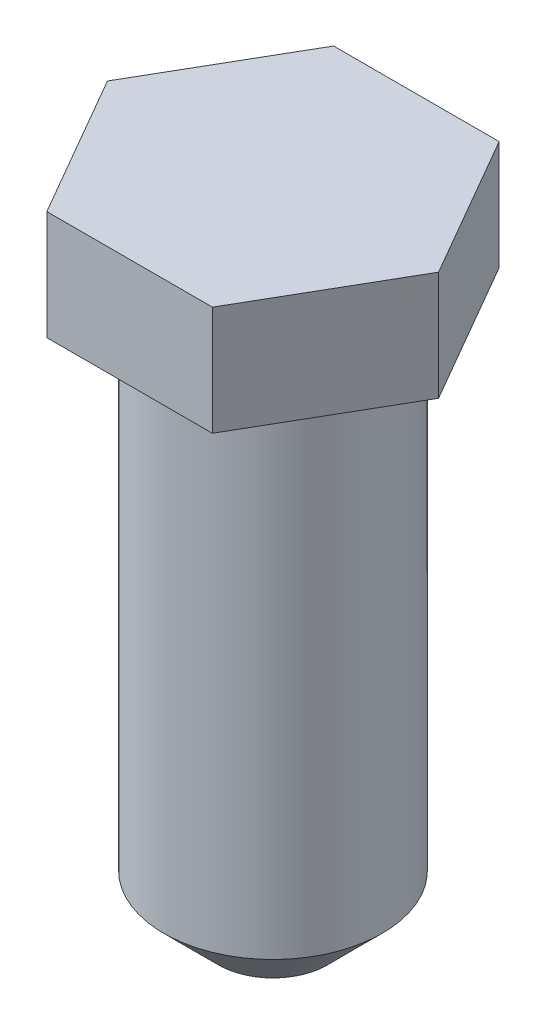
ISO-10303-21;
HEADER;
FILE_DESCRIPTION(('STEP AP214'),'2;1');
FILE_NAME('part.step','',(''),(''),'','','');
FILE_SCHEMA(('AUTOMOTIVE_DESIGN { 1 0 10303 214 1 1 1 1 }'));
ENDSEC;
DATA;
#1=APPLICATION_CONTEXT('core data for automotive mechanical design processes');
#2=APPLICATION_PROTOCOL_DEFINITION('international standard','automotive_design',2000,#1);
#3=PRODUCT_CONTEXT('',#1,'mechanical');
#4=PRODUCT('Part','Part','',(#3));
#5=PRODUCT_RELATED_PRODUCT_CATEGORY('part','',(#4));
#6=PRODUCT_DEFINITION_FORMATION('','',#4);
#7=PRODUCT_DEFINITION_CONTEXT('part definition',#1,'design');
#8=PRODUCT_DEFINITION('design','',#6,#7);
#9=PRODUCT_DEFINITION_SHAPE('','',#8);
#10=(LENGTH_UNIT() NAMED_UNIT(*) SI_UNIT(.MILLI.,.METRE.));
#11=(NAMED_UNIT(*) PLANE_ANGLE_UNIT() SI_UNIT($,.RADIAN.));
#12=(NAMED_UNIT(*) SI_UNIT($,.STERADIAN.) SOLID_ANGLE_UNIT());
#13=UNCERTAINTY_MEASURE_WITH_UNIT(LENGTH_MEASURE(1.E-05),#10,'distance_accuracy_value','');
#14=(GEOMETRIC_REPRESENTATION_CONTEXT(3) GLOBAL_UNCERTAINTY_ASSIGNED_CONTEXT((#13)) GLOBAL_UNIT_ASSIGNED_CONTEXT((#10,
#11,#12)) REPRESENTATION_CONTEXT('',''));
#15=CARTESIAN_POINT('',(0.,0.,0.));
#16=DIRECTION('',(0.,0.,1.));
#17=DIRECTION('',(1.,0.,0.));
#18=AXIS2_PLACEMENT_3D('',#15,#16,#17);
#19=CARTESIAN_POINT('',(9.62370729955479,12.7,16.6687499999999));
#20=DIRECTION('',(-0.866025403784442,0.,-0.499999999999995));
#21=DIRECTION('',(-0.499999999999995,0.,0.866025403784442));
#22=AXIS2_PLACEMENT_3D('',#19,#20,#21);
#23=PLANE('',#22);
#24=DIRECTION('',(0.499999999999995,0.,-0.866025403784442));
#25=VECTOR('',#24,1.);
#26=CARTESIAN_POINT('',(9.62370729955479,0.,16.6687499999999));
#27=LINE('',#26,#25);
#28=CARTESIAN_POINT('',(9.62370729955479,0.,16.6687499999999));
#29=VERTEX_POINT('',#28);
#30=CARTESIAN_POINT('',(19.2474145991092,0.,0.));
#31=VERTEX_POINT('',#30);
#32=EDGE_CURVE('E119',#29,#31,#27,.T.);
#33=ORIENTED_EDGE('',*,*,#32,.T.);
#34=DIRECTION('',(0.,-1.,0.));
#35=VECTOR('',#34,1.);
#36=CARTESIAN_POINT('',(19.2474145991092,12.7,0.));
#37=LINE('',#36,#35);
#38=CARTESIAN_POINT('',(19.2474145991092,12.7,0.));
#39=VERTEX_POINT('',#38);
#40=EDGE_CURVE('E136',#39,#31,#37,.T.);
#41=ORIENTED_EDGE('',*,*,#40,.F.);
#42=DIRECTION('',(0.499999999999995,0.,-0.866025403784442));
#43=VECTOR('',#42,1.);
#44=CARTESIAN_POINT('',(9.62370729955479,12.7,16.6687499999999));
#45=LINE('',#44,#43);
#46=CARTESIAN_POINT('',(9.62370729955479,12.7,16.6687499999999));
#47=VERTEX_POINT('',#46);
#48=EDGE_CURVE('E129',#47,#39,#45,.T.);
#49=ORIENTED_EDGE('',*,*,#48,.F.);
#50=DIRECTION('',(0.,-1.,0.));
#51=VECTOR('',#50,1.);
#52=CARTESIAN_POINT('',(9.62370729955479,12.7,16.6687499999999));
#53=LINE('',#52,#51);
#54=EDGE_CURVE('E115',#47,#29,#53,.T.);
#55=ORIENTED_EDGE('',*,*,#54,.T.);
#56=EDGE_LOOP('',(#33,#41,#49,#55));
#57=FACE_BOUND('',#56,.T.);
#58=ADVANCED_FACE('F33',(#57),#23,.F.);
#59=CARTESIAN_POINT('',(19.2474145991092,12.7,0.));
#60=DIRECTION('',(-0.866025403784438,0.,0.500000000000001));
#61=DIRECTION('',(0.500000000000001,0.,0.866025403784438));
#62=AXIS2_PLACEMENT_3D('',#59,#60,#61);
#63=PLANE('',#62);
#64=DIRECTION('',(-0.500000000000001,0.,-0.866025403784438));
#65=VECTOR('',#64,1.);
#66=CARTESIAN_POINT('',(19.2474145991092,0.,0.));
#67=LINE('',#66,#65);
#68=CARTESIAN_POINT('',(9.62370729955456,0.,-16.6687500000001));
#69=VERTEX_POINT('',#68);
#70=EDGE_CURVE('E122',#31,#69,#67,.T.);
#71=ORIENTED_EDGE('',*,*,#70,.T.);
#72=DIRECTION('',(0.,-1.,0.));
#73=VECTOR('',#72,1.);
#74=CARTESIAN_POINT('',(9.62370729955456,12.7,-16.6687500000001));
#75=LINE('',#74,#73);
#76=CARTESIAN_POINT('',(9.62370729955456,12.7,-16.6687500000001));
#77=VERTEX_POINT('',#76);
#78=EDGE_CURVE('E133',#77,#69,#75,.T.);
#79=ORIENTED_EDGE('',*,*,#78,.F.);
#80=DIRECTION('',(-0.500000000000001,0.,-0.866025403784438));
#81=VECTOR('',#80,1.);
#82=CARTESIAN_POINT('',(19.2474145991092,12.7,0.));
#83=LINE('',#82,#81);
#84=EDGE_CURVE('E88',#39,#77,#83,.T.);
#85=ORIENTED_EDGE('',*,*,#84,.F.);
#86=ORIENTED_EDGE('',*,*,#40,.T.);
#87=EDGE_LOOP('',(#71,#79,#85,#86));
#88=FACE_BOUND('',#87,.T.);
#89=ADVANCED_FACE('F149',(#88),#63,.F.);
#90=CARTESIAN_POINT('',(9.62370729955456,12.7,-16.6687500000001));
#91=DIRECTION('',(0.,0.,1.));
#92=DIRECTION('',(1.,0.,0.));
#93=AXIS2_PLACEMENT_3D('',#90,#91,#92);
#94=PLANE('',#93);
#95=DIRECTION('',(-1.,0.,0.));
#96=VECTOR('',#95,1.);
#97=CARTESIAN_POINT('',(9.62370729955456,0.,-16.6687500000001));
#98=LINE('',#97,#96);
#99=CARTESIAN_POINT('',(-9.62370729955468,0.,-16.66875));
#100=VERTEX_POINT('',#99);
#101=EDGE_CURVE('E124',#69,#100,#98,.T.);
#102=ORIENTED_EDGE('',*,*,#101,.T.);
#103=DIRECTION('',(0.,-1.,0.));
#104=VECTOR('',#103,1.);
#105=CARTESIAN_POINT('',(-9.62370729955468,12.7,-16.66875));
#106=LINE('',#105,#104);
#107=CARTESIAN_POINT('',(-9.62370729955468,12.7,-16.66875));
#108=VERTEX_POINT('',#107);
#109=EDGE_CURVE('E110',#108,#100,#106,.T.);
#110=ORIENTED_EDGE('',*,*,#109,.F.);
#111=DIRECTION('',(-1.,0.,0.));
#112=VECTOR('',#111,1.);
#113=CARTESIAN_POINT('',(9.62370729955456,12.7,-16.6687500000001));
#114=LINE('',#113,#112);
#115=EDGE_CURVE('E101',#77,#108,#114,.T.);
#116=ORIENTED_EDGE('',*,*,#115,.F.);
#117=ORIENTED_EDGE('',*,*,#78,.T.);
#118=EDGE_LOOP('',(#102,#110,#116,#117));
#119=FACE_BOUND('',#118,.T.);
#120=ADVANCED_FACE('F152',(#119),#94,.F.);
#121=CARTESIAN_POINT('',(-9.62370729955468,12.7,-16.66875));
#122=DIRECTION('',(0.866025403784442,0.,0.499999999999995));
#123=DIRECTION('',(0.499999999999995,0.,-0.866025403784442));
#124=AXIS2_PLACEMENT_3D('',#121,#122,#123);
#125=PLANE('',#124);
#126=DIRECTION('',(-0.499999999999995,0.,0.866025403784442));
#127=VECTOR('',#126,1.);
#128=CARTESIAN_POINT('',(-9.62370729955468,0.,-16.66875));
#129=LINE('',#128,#127);
#130=CARTESIAN_POINT('',(-19.2474145991092,0.,1.34403977787533E-13));
#131=VERTEX_POINT('',#130);
#132=EDGE_CURVE('E109',#100,#131,#129,.T.);
#133=ORIENTED_EDGE('',*,*,#132,.T.);
#134=DIRECTION('',(0.,-1.,0.));
#135=VECTOR('',#134,1.);
#136=CARTESIAN_POINT('',(-19.2474145991092,12.7,1.34403977787533E-13));
#137=LINE('',#136,#135);
#138=CARTESIAN_POINT('',(-19.2474145991092,12.7,1.34403977787533E-13));
#139=VERTEX_POINT('',#138);
#140=EDGE_CURVE('E106',#139,#131,#137,.T.);
#141=ORIENTED_EDGE('',*,*,#140,.F.);
#142=DIRECTION('',(-0.499999999999995,0.,0.866025403784442));
#143=VECTOR('',#142,1.);
#144=CARTESIAN_POINT('',(-9.62370729955468,12.7,-16.66875));
#145=LINE('',#144,#143);
#146=EDGE_CURVE('E95',#108,#139,#145,.T.);
#147=ORIENTED_EDGE('',*,*,#146,.F.);
#148=ORIENTED_EDGE('',*,*,#109,.T.);
#149=EDGE_LOOP('',(#133,#141,#147,#148));
#150=FACE_BOUND('',#149,.T.);
#151=ADVANCED_FACE('F107',(#150),#125,.F.);
#152=CARTESIAN_POINT('',(-19.2474145991092,12.7,1.34403977787533E-13));
#153=DIRECTION('',(0.866025403784434,0.,-0.500000000000007));
#154=DIRECTION('',(-0.500000000000007,0.,-0.866025403784435));
#155=AXIS2_PLACEMENT_3D('',#152,#153,#154);
#156=PLANE('',#155);
#157=DIRECTION('',(0.500000000000007,0.,0.866025403784435));
#158=VECTOR('',#157,1.);
#159=CARTESIAN_POINT('',(-19.2474145991092,0.,1.34403977787533E-13));
#160=LINE('',#159,#158);
#161=CARTESIAN_POINT('',(-9.62370729955445,0.,16.6687500000001));
#162=VERTEX_POINT('',#161);
#163=EDGE_CURVE('E73',#131,#162,#160,.T.);
#164=ORIENTED_EDGE('',*,*,#163,.T.);
#165=DIRECTION('',(0.,-1.,0.));
#166=VECTOR('',#165,1.);
#167=CARTESIAN_POINT('',(-9.62370729955445,12.7,16.6687500000001));
#168=LINE('',#167,#166);
#169=CARTESIAN_POINT('',(-9.62370729955445,12.7,16.6687500000001));
#170=VERTEX_POINT('',#169);
#171=EDGE_CURVE('E111',#170,#162,#168,.T.);
#172=ORIENTED_EDGE('',*,*,#171,.F.);
#173=DIRECTION('',(0.500000000000007,0.,0.866025403784435));
#174=VECTOR('',#173,1.);
#175=CARTESIAN_POINT('',(-19.2474145991092,12.7,1.34403977787533E-13));
#176=LINE('',#175,#174);
#177=EDGE_CURVE('E99',#139,#170,#176,.T.);
#178=ORIENTED_EDGE('',*,*,#177,.F.);
#179=ORIENTED_EDGE('',*,*,#140,.T.);
#180=EDGE_LOOP('',(#164,#172,#178,#179));
#181=FACE_BOUND('',#180,.T.);
#182=ADVANCED_FACE('F113',(#181),#156,.F.);
#183=CARTESIAN_POINT('',(-9.62370729955445,12.7,16.6687500000001));
#184=DIRECTION('',(0.,0.,-1.));
#185=DIRECTION('',(-1.,0.,0.));
#186=AXIS2_PLACEMENT_3D('',#183,#184,#185);
#187=PLANE('',#186);
#188=DIRECTION('',(1.,0.,0.));
#189=VECTOR('',#188,1.);
#190=CARTESIAN_POINT('',(-9.62370729955445,0.,16.6687500000001));
#191=LINE('',#190,#189);
#192=EDGE_CURVE('E79',#162,#29,#191,.T.);
#193=ORIENTED_EDGE('',*,*,#192,.T.);
#194=ORIENTED_EDGE('',*,*,#54,.F.);
#195=DIRECTION('',(1.,0.,0.));
#196=VECTOR('',#195,1.);
#197=CARTESIAN_POINT('',(-9.62370729955445,12.7,16.6687500000001));
#198=LINE('',#197,#196);
#199=EDGE_CURVE('E50',#170,#47,#198,.T.);
#200=ORIENTED_EDGE('',*,*,#199,.F.);
#201=ORIENTED_EDGE('',*,*,#171,.T.);
#202=EDGE_LOOP('',(#193,#194,#200,#201));
#203=FACE_BOUND('',#202,.T.);
#204=ADVANCED_FACE('F157',(#203),#187,.F.);
#205=CARTESIAN_POINT('',(0.,12.7,0.));
#206=DIRECTION('',(0.,1.,0.));
#207=DIRECTION('',(0.,0.,1.));
#208=AXIS2_PLACEMENT_3D('',#205,#206,#207);
#209=PLANE('',#208);
#210=ORIENTED_EDGE('',*,*,#48,.T.);
#211=ORIENTED_EDGE('',*,*,#84,.T.);
#212=ORIENTED_EDGE('',*,*,#115,.T.);
#213=ORIENTED_EDGE('',*,*,#146,.T.);
#214=ORIENTED_EDGE('',*,*,#177,.T.);
#215=ORIENTED_EDGE('',*,*,#199,.T.);
#216=EDGE_LOOP('',(#210,#211,#212,#213,#214,#215));
#217=FACE_BOUND('',#216,.T.);
#218=ADVANCED_FACE('F97',(#217),#209,.T.);
#219=CARTESIAN_POINT('',(0.,0.,0.));
#220=DIRECTION('',(0.,1.,0.));
#221=DIRECTION('',(0.,0.,1.));
#222=AXIS2_PLACEMENT_3D('',#219,#220,#221);
#223=PLANE('',#222);
#224=CARTESIAN_POINT('',(0.,0.,0.));
#225=DIRECTION('',(0.,-1.,0.));
#226=DIRECTION('',(0.,0.,-1.));
#227=AXIS2_PLACEMENT_3D('',#224,#225,#226);
#228=CIRCLE('',#227,12.7);
#229=CARTESIAN_POINT('',(0.,0.,-12.7));
#230=VERTEX_POINT('',#229);
#231=EDGE_CURVE('E137',#230,#230,#228,.T.);
#232=ORIENTED_EDGE('',*,*,#231,.F.);
#233=EDGE_LOOP('',(#232));
#234=FACE_BOUND('',#233,.T.);
#235=ORIENTED_EDGE('',*,*,#32,.F.);
#236=ORIENTED_EDGE('',*,*,#192,.F.);
#237=ORIENTED_EDGE('',*,*,#163,.F.);
#238=ORIENTED_EDGE('',*,*,#132,.F.);
#239=ORIENTED_EDGE('',*,*,#101,.F.);
#240=ORIENTED_EDGE('',*,*,#70,.F.);
#241=EDGE_LOOP('',(#235,#236,#237,#238,#239,#240));
#242=FACE_BOUND('',#241,.T.);
#243=ADVANCED_FACE('F155',(#234,#242),#223,.F.);
#244=CARTESIAN_POINT('',(0.,-57.15,0.));
#245=DIRECTION('',(0.,1.,0.));
#246=DIRECTION('',(0.,0.,1.));
#247=AXIS2_PLACEMENT_3D('',#244,#245,#246);
#248=CYLINDRICAL_SURFACE('',#247,12.7);
#249=CARTESIAN_POINT('',(0.,-57.15,0.));
#250=DIRECTION('',(0.,-1.,0.));
#251=DIRECTION('',(0.,0.,-1.));
#252=AXIS2_PLACEMENT_3D('',#249,#250,#251);
#253=CIRCLE('',#252,12.7);
#254=CARTESIAN_POINT('',(0.,-57.15,-12.7));
#255=VERTEX_POINT('',#254);
#256=EDGE_CURVE('E11',#255,#255,#253,.F.);
#257=ORIENTED_EDGE('',*,*,#256,.T.);
#258=EDGE_LOOP('',(#257));
#259=FACE_BOUND('',#258,.T.);
#260=ORIENTED_EDGE('',*,*,#231,.T.);
#261=EDGE_LOOP('',(#260));
#262=FACE_BOUND('',#261,.T.);
#263=ADVANCED_FACE('F203',(#259,#262),#248,.T.);
#264=CARTESIAN_POINT('',(0.,-63.5,0.));
#265=DIRECTION('',(0.,-1.,0.));
#266=DIRECTION('',(0.,0.,-1.));
#267=AXIS2_PLACEMENT_3D('',#264,#265,#266);
#268=PLANE('',#267);
#269=CARTESIAN_POINT('',(0.,-63.5,0.));
#270=DIRECTION('',(0.,-1.,0.));
#271=DIRECTION('',(0.,0.,-1.));
#272=AXIS2_PLACEMENT_3D('',#269,#270,#271);
#273=CIRCLE('',#272,6.35000000000002);
#274=CARTESIAN_POINT('',(0.,-63.5,-6.35000000000002));
#275=VERTEX_POINT('',#274);
#276=EDGE_CURVE('E42',#275,#275,#273,.T.);
#277=ORIENTED_EDGE('',*,*,#276,.T.);
#278=EDGE_LOOP('',(#277));
#279=FACE_BOUND('',#278,.T.);
#280=ADVANCED_FACE('F213',(#279),#268,.T.);
#281=CARTESIAN_POINT('',(0.,-63.5,0.));
#282=DIRECTION('',(0.,1.,0.));
#283=DIRECTION('',(0.,0.,1.));
#284=AXIS2_PLACEMENT_3D('',#281,#282,#283);
#285=CONICAL_SURFACE('',#284,6.35000000000002,0.785398163397447);
#286=ORIENTED_EDGE('',*,*,#256,.F.);
#287=EDGE_LOOP('',(#286));
#288=FACE_BOUND('',#287,.T.);
#289=ORIENTED_EDGE('',*,*,#276,.F.);
#290=EDGE_LOOP('',(#289));
#291=FACE_BOUND('',#290,.T.);
#292=ADVANCED_FACE('F35',(#288,#291),#285,.T.);
#293=CLOSED_SHELL('',(#58,#89,#120,#151,#182,#204,#218,#243,#263,#280,#292));
#294=MANIFOLD_SOLID_BREP('B2',#293);
#295=ADVANCED_BREP_SHAPE_REPRESENTATION('',(#18,#294),#14);
#296=SHAPE_DEFINITION_REPRESENTATION(#9,#295);
ENDSEC;
END-ISO-10303-21;
